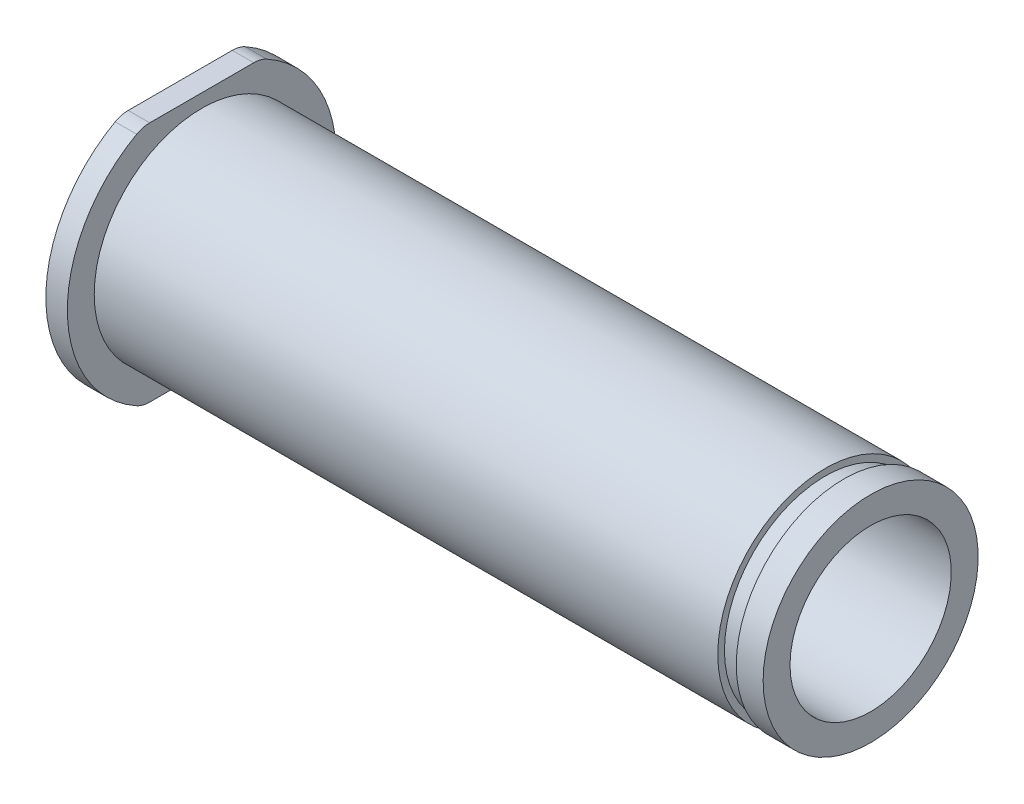
ISO-10303-21;
HEADER;
FILE_DESCRIPTION(('STEP AP214'),'2;1');
FILE_NAME('part.step','',(''),(''),'','','');
FILE_SCHEMA(('AUTOMOTIVE_DESIGN { 1 0 10303 214 1 1 1 1 }'));
ENDSEC;
DATA;
#1=APPLICATION_CONTEXT('core data for automotive mechanical design processes');
#2=APPLICATION_PROTOCOL_DEFINITION('international standard','automotive_design',2000,#1);
#3=PRODUCT_CONTEXT('',#1,'mechanical');
#4=PRODUCT('Part','Part','',(#3));
#5=PRODUCT_RELATED_PRODUCT_CATEGORY('part','',(#4));
#6=PRODUCT_DEFINITION_FORMATION('','',#4);
#7=PRODUCT_DEFINITION_CONTEXT('part definition',#1,'design');
#8=PRODUCT_DEFINITION('design','',#6,#7);
#9=PRODUCT_DEFINITION_SHAPE('','',#8);
#10=(LENGTH_UNIT() NAMED_UNIT(*) SI_UNIT(.MILLI.,.METRE.));
#11=(NAMED_UNIT(*) PLANE_ANGLE_UNIT() SI_UNIT($,.RADIAN.));
#12=(NAMED_UNIT(*) SI_UNIT($,.STERADIAN.) SOLID_ANGLE_UNIT());
#13=UNCERTAINTY_MEASURE_WITH_UNIT(LENGTH_MEASURE(1.E-05),#10,'distance_accuracy_value','');
#14=(GEOMETRIC_REPRESENTATION_CONTEXT(3) GLOBAL_UNCERTAINTY_ASSIGNED_CONTEXT((#13)) GLOBAL_UNIT_ASSIGNED_CONTEXT((#10,
#11,#12)) REPRESENTATION_CONTEXT('',''));
#15=CARTESIAN_POINT('',(0.,0.,0.));
#16=DIRECTION('',(0.,0.,1.));
#17=DIRECTION('',(1.,0.,0.));
#18=AXIS2_PLACEMENT_3D('',#15,#16,#17);
#19=CARTESIAN_POINT('',(0.,0.,0.));
#20=DIRECTION('',(-1.,0.,0.));
#21=DIRECTION('',(0.,0.,1.));
#22=AXIS2_PLACEMENT_3D('',#19,#20,#21);
#23=CYLINDRICAL_SURFACE('',#22,15.875);
#24=CARTESIAN_POINT('',(2.54,0.,0.));
#25=DIRECTION('',(-1.,0.,0.));
#26=DIRECTION('',(0.,0.,1.));
#27=AXIS2_PLACEMENT_3D('',#24,#25,#26);
#28=CIRCLE('',#27,15.875);
#29=CARTESIAN_POINT('',(2.54,13.890625,-7.68545132763035));
#30=VERTEX_POINT('',#29);
#31=CARTESIAN_POINT('',(2.54,-13.890625,-7.68545132763035));
#32=VERTEX_POINT('',#31);
#33=EDGE_CURVE('E140',#30,#32,#28,.T.);
#34=ORIENTED_EDGE('',*,*,#33,.T.);
#35=DIRECTION('',(-1.,0.,0.));
#36=VECTOR('',#35,1.);
#37=CARTESIAN_POINT('',(0.,-13.890625,-7.68545132763035));
#38=LINE('',#37,#36);
#39=CARTESIAN_POINT('',(0.,-13.890625,-7.68545132763035));
#40=VERTEX_POINT('',#39);
#41=EDGE_CURVE('E105',#32,#40,#38,.T.);
#42=ORIENTED_EDGE('',*,*,#41,.T.);
#43=CARTESIAN_POINT('',(0.,0.,0.));
#44=DIRECTION('',(-1.,0.,0.));
#45=DIRECTION('',(0.,0.,1.));
#46=AXIS2_PLACEMENT_3D('',#43,#44,#45);
#47=CIRCLE('',#46,15.875);
#48=CARTESIAN_POINT('',(0.,13.890625,-7.68545132763035));
#49=VERTEX_POINT('',#48);
#50=EDGE_CURVE('E139',#49,#40,#47,.T.);
#51=ORIENTED_EDGE('',*,*,#50,.F.);
#52=DIRECTION('',(-1.,0.,0.));
#53=VECTOR('',#52,1.);
#54=CARTESIAN_POINT('',(0.,13.890625,-7.68545132763035));
#55=LINE('',#54,#53);
#56=EDGE_CURVE('E110',#49,#30,#55,.F.);
#57=ORIENTED_EDGE('',*,*,#56,.T.);
#58=EDGE_LOOP('',(#34,#42,#51,#57));
#59=FACE_BOUND('',#58,.T.);
#60=ADVANCED_FACE('F33',(#59),#23,.T.);
#61=CARTESIAN_POINT('',(0.,15.875,0.));
#62=DIRECTION('',(1.,0.,0.));
#63=DIRECTION('',(0.,0.,-1.));
#64=AXIS2_PLACEMENT_3D('',#61,#62,#63);
#65=PLANE('',#64);
#66=CARTESIAN_POINT('',(0.,0.,0.));
#67=DIRECTION('',(-1.,0.,0.));
#68=DIRECTION('',(0.,0.,1.));
#69=AXIS2_PLACEMENT_3D('',#66,#67,#68);
#70=CIRCLE('',#69,9.525);
#71=CARTESIAN_POINT('',(0.,0.,9.525));
#72=VERTEX_POINT('',#71);
#73=EDGE_CURVE('E164',#72,#72,#70,.T.);
#74=ORIENTED_EDGE('',*,*,#73,.F.);
#75=EDGE_LOOP('',(#74));
#76=FACE_BOUND('',#75,.T.);
#77=ORIENTED_EDGE('',*,*,#50,.T.);
#78=CARTESIAN_POINT('',(0.,-11.1125,-6.14836106210428));
#79=DIRECTION('',(1.,0.,0.));
#80=DIRECTION('',(0.,0.,-1.));
#81=AXIS2_PLACEMENT_3D('',#78,#79,#80);
#82=CIRCLE('',#81,3.175);
#83=CARTESIAN_POINT('',(0.,-14.2875,-6.14836106210428));
#84=VERTEX_POINT('',#83);
#85=EDGE_CURVE('E178',#40,#84,#82,.F.);
#86=ORIENTED_EDGE('',*,*,#85,.T.);
#87=DIRECTION('',(0.,0.,-1.));
#88=VECTOR('',#87,1.);
#89=CARTESIAN_POINT('',(0.,-14.2875,-6.91975207287082));
#90=LINE('',#89,#88);
#91=CARTESIAN_POINT('',(0.,-14.2875,6.14836106210427));
#92=VERTEX_POINT('',#91);
#93=EDGE_CURVE('E121',#92,#84,#90,.T.);
#94=ORIENTED_EDGE('',*,*,#93,.F.);
#95=CARTESIAN_POINT('',(0.,-11.1125,6.14836106210427));
#96=DIRECTION('',(1.,0.,0.));
#97=DIRECTION('',(0.,0.,-1.));
#98=AXIS2_PLACEMENT_3D('',#95,#96,#97);
#99=CIRCLE('',#98,3.175);
#100=CARTESIAN_POINT('',(0.,-13.890625,7.68545132763034));
#101=VERTEX_POINT('',#100);
#102=EDGE_CURVE('E176',#92,#101,#99,.F.);
#103=ORIENTED_EDGE('',*,*,#102,.T.);
#104=CARTESIAN_POINT('',(0.,13.890625,7.68545132763034));
#105=VERTEX_POINT('',#104);
#106=EDGE_CURVE('E137',#101,#105,#47,.T.);
#107=ORIENTED_EDGE('',*,*,#106,.T.);
#108=CARTESIAN_POINT('',(0.,11.1125,6.14836106210427));
#109=DIRECTION('',(1.,0.,0.));
#110=DIRECTION('',(0.,0.,-1.));
#111=AXIS2_PLACEMENT_3D('',#108,#109,#110);
#112=CIRCLE('',#111,3.175);
#113=CARTESIAN_POINT('',(0.,14.2875,6.14836106210427));
#114=VERTEX_POINT('',#113);
#115=EDGE_CURVE('E48',#105,#114,#112,.F.);
#116=ORIENTED_EDGE('',*,*,#115,.T.);
#117=DIRECTION('',(0.,0.,1.));
#118=VECTOR('',#117,1.);
#119=CARTESIAN_POINT('',(0.,14.2875,-6.91975207287082));
#120=LINE('',#119,#118);
#121=CARTESIAN_POINT('',(0.,14.2875,-6.14836106210428));
#122=VERTEX_POINT('',#121);
#123=EDGE_CURVE('E130',#122,#114,#120,.T.);
#124=ORIENTED_EDGE('',*,*,#123,.F.);
#125=CARTESIAN_POINT('',(0.,11.1125,-6.14836106210428));
#126=DIRECTION('',(1.,0.,0.));
#127=DIRECTION('',(0.,0.,-1.));
#128=AXIS2_PLACEMENT_3D('',#125,#126,#127);
#129=CIRCLE('',#128,3.175);
#130=EDGE_CURVE('E56',#122,#49,#129,.F.);
#131=ORIENTED_EDGE('',*,*,#130,.T.);
#132=EDGE_LOOP('',(#77,#86,#94,#103,#107,#116,#124,#131));
#133=FACE_BOUND('',#132,.T.);
#134=ADVANCED_FACE('F193',(#76,#133),#65,.F.);
#135=CARTESIAN_POINT('',(0.,0.,0.));
#136=DIRECTION('',(-1.,0.,0.));
#137=DIRECTION('',(0.,0.,1.));
#138=AXIS2_PLACEMENT_3D('',#135,#136,#137);
#139=CYLINDRICAL_SURFACE('',#138,9.525);
#140=CARTESIAN_POINT('',(81.5594,0.,0.));
#141=DIRECTION('',(-1.,0.,0.));
#142=DIRECTION('',(0.,0.,1.));
#143=AXIS2_PLACEMENT_3D('',#140,#141,#142);
#144=CIRCLE('',#143,9.525);
#145=CARTESIAN_POINT('',(81.5594,0.,9.525));
#146=VERTEX_POINT('',#145);
#147=EDGE_CURVE('E161',#146,#146,#144,.T.);
#148=ORIENTED_EDGE('',*,*,#147,.F.);
#149=EDGE_LOOP('',(#148));
#150=FACE_BOUND('',#149,.T.);
#151=ORIENTED_EDGE('',*,*,#73,.T.);
#152=EDGE_LOOP('',(#151));
#153=FACE_BOUND('',#152,.T.);
#154=ADVANCED_FACE('F211',(#150,#153),#139,.F.);
#155=CARTESIAN_POINT('',(81.5594,9.525,0.));
#156=DIRECTION('',(-1.,0.,0.));
#157=DIRECTION('',(0.,0.,1.));
#158=AXIS2_PLACEMENT_3D('',#155,#156,#157);
#159=PLANE('',#158);
#160=CARTESIAN_POINT('',(81.5594,0.,0.));
#161=DIRECTION('',(-1.,0.,0.));
#162=DIRECTION('',(0.,0.,1.));
#163=AXIS2_PLACEMENT_3D('',#160,#161,#162);
#164=CIRCLE('',#163,12.7);
#165=CARTESIAN_POINT('',(81.5594,0.,12.7));
#166=VERTEX_POINT('',#165);
#167=EDGE_CURVE('E158',#166,#166,#164,.T.);
#168=ORIENTED_EDGE('',*,*,#167,.F.);
#169=EDGE_LOOP('',(#168));
#170=FACE_BOUND('',#169,.T.);
#171=ORIENTED_EDGE('',*,*,#147,.T.);
#172=EDGE_LOOP('',(#171));
#173=FACE_BOUND('',#172,.T.);
#174=ADVANCED_FACE('F243',(#170,#173),#159,.F.);
#175=CARTESIAN_POINT('',(0.,0.,0.));
#176=DIRECTION('',(-1.,0.,0.));
#177=DIRECTION('',(0.,0.,1.));
#178=AXIS2_PLACEMENT_3D('',#175,#176,#177);
#179=CYLINDRICAL_SURFACE('',#178,12.7);
#180=CARTESIAN_POINT('',(78.3844,0.,0.));
#181=DIRECTION('',(-1.,0.,0.));
#182=DIRECTION('',(0.,0.,1.));
#183=AXIS2_PLACEMENT_3D('',#180,#181,#182);
#184=CIRCLE('',#183,12.7);
#185=CARTESIAN_POINT('',(78.3844,0.,12.7));
#186=VERTEX_POINT('',#185);
#187=EDGE_CURVE('E155',#186,#186,#184,.T.);
#188=ORIENTED_EDGE('',*,*,#187,.F.);
#189=EDGE_LOOP('',(#188));
#190=FACE_BOUND('',#189,.T.);
#191=ORIENTED_EDGE('',*,*,#167,.T.);
#192=EDGE_LOOP('',(#191));
#193=FACE_BOUND('',#192,.T.);
#194=ADVANCED_FACE('F239',(#190,#193),#179,.T.);
#195=CARTESIAN_POINT('',(78.3844,12.7,0.));
#196=DIRECTION('',(1.,0.,0.));
#197=DIRECTION('',(0.,0.,-1.));
#198=AXIS2_PLACEMENT_3D('',#195,#196,#197);
#199=PLANE('',#198);
#200=CARTESIAN_POINT('',(78.3844,0.,0.));
#201=DIRECTION('',(-1.,0.,0.));
#202=DIRECTION('',(0.,0.,1.));
#203=AXIS2_PLACEMENT_3D('',#200,#201,#202);
#204=CIRCLE('',#203,11.9126);
#205=CARTESIAN_POINT('',(78.3844,0.,11.9126));
#206=VERTEX_POINT('',#205);
#207=EDGE_CURVE('E152',#206,#206,#204,.T.);
#208=ORIENTED_EDGE('',*,*,#207,.F.);
#209=EDGE_LOOP('',(#208));
#210=FACE_BOUND('',#209,.T.);
#211=ORIENTED_EDGE('',*,*,#187,.T.);
#212=EDGE_LOOP('',(#211));
#213=FACE_BOUND('',#212,.T.);
#214=ADVANCED_FACE('F235',(#210,#213),#199,.F.);
#215=CARTESIAN_POINT('',(0.,0.,0.));
#216=DIRECTION('',(-1.,0.,0.));
#217=DIRECTION('',(0.,0.,1.));
#218=AXIS2_PLACEMENT_3D('',#215,#216,#217);
#219=CYLINDRICAL_SURFACE('',#218,11.9126);
#220=CARTESIAN_POINT('',(76.2,0.,0.));
#221=DIRECTION('',(-1.,0.,0.));
#222=DIRECTION('',(0.,0.,1.));
#223=AXIS2_PLACEMENT_3D('',#220,#221,#222);
#224=CIRCLE('',#223,11.9126);
#225=CARTESIAN_POINT('',(76.2,0.,11.9126));
#226=VERTEX_POINT('',#225);
#227=EDGE_CURVE('E149',#226,#226,#224,.T.);
#228=ORIENTED_EDGE('',*,*,#227,.F.);
#229=EDGE_LOOP('',(#228));
#230=FACE_BOUND('',#229,.T.);
#231=ORIENTED_EDGE('',*,*,#207,.T.);
#232=EDGE_LOOP('',(#231));
#233=FACE_BOUND('',#232,.T.);
#234=ADVANCED_FACE('F231',(#230,#233),#219,.T.);
#235=CARTESIAN_POINT('',(76.2,11.9126,0.));
#236=DIRECTION('',(-1.,0.,0.));
#237=DIRECTION('',(0.,0.,1.));
#238=AXIS2_PLACEMENT_3D('',#235,#236,#237);
#239=PLANE('',#238);
#240=CARTESIAN_POINT('',(76.2,0.,0.));
#241=DIRECTION('',(-1.,0.,0.));
#242=DIRECTION('',(0.,0.,1.));
#243=AXIS2_PLACEMENT_3D('',#240,#241,#242);
#244=CIRCLE('',#243,12.7);
#245=CARTESIAN_POINT('',(76.2,0.,12.7));
#246=VERTEX_POINT('',#245);
#247=EDGE_CURVE('E146',#246,#246,#244,.T.);
#248=ORIENTED_EDGE('',*,*,#247,.F.);
#249=EDGE_LOOP('',(#248));
#250=FACE_BOUND('',#249,.T.);
#251=ORIENTED_EDGE('',*,*,#227,.T.);
#252=EDGE_LOOP('',(#251));
#253=FACE_BOUND('',#252,.T.);
#254=ADVANCED_FACE('F225',(#250,#253),#239,.F.);
#255=CARTESIAN_POINT('',(0.,0.,0.));
#256=DIRECTION('',(-1.,0.,0.));
#257=DIRECTION('',(0.,0.,1.));
#258=AXIS2_PLACEMENT_3D('',#255,#256,#257);
#259=CYLINDRICAL_SURFACE('',#258,12.7);
#260=CARTESIAN_POINT('',(2.54,0.,0.));
#261=DIRECTION('',(-1.,0.,0.));
#262=DIRECTION('',(0.,0.,1.));
#263=AXIS2_PLACEMENT_3D('',#260,#261,#262);
#264=CIRCLE('',#263,12.7);
#265=CARTESIAN_POINT('',(2.54,0.,12.7));
#266=VERTEX_POINT('',#265);
#267=EDGE_CURVE('E142',#266,#266,#264,.T.);
#268=ORIENTED_EDGE('',*,*,#267,.F.);
#269=EDGE_LOOP('',(#268));
#270=FACE_BOUND('',#269,.T.);
#271=ORIENTED_EDGE('',*,*,#247,.T.);
#272=EDGE_LOOP('',(#271));
#273=FACE_BOUND('',#272,.T.);
#274=ADVANCED_FACE('F221',(#270,#273),#259,.T.);
#275=CARTESIAN_POINT('',(2.54,12.7,0.));
#276=DIRECTION('',(-1.,0.,0.));
#277=DIRECTION('',(0.,0.,1.));
#278=AXIS2_PLACEMENT_3D('',#275,#276,#277);
#279=PLANE('',#278);
#280=DIRECTION('',(0.,0.,1.));
#281=VECTOR('',#280,1.);
#282=CARTESIAN_POINT('',(2.54,-14.2875,-6.91975207287082));
#283=LINE('',#282,#281);
#284=CARTESIAN_POINT('',(2.54,-14.2875,-6.14836106210428));
#285=VERTEX_POINT('',#284);
#286=CARTESIAN_POINT('',(2.54,-14.2875,6.14836106210427));
#287=VERTEX_POINT('',#286);
#288=EDGE_CURVE('E118',#285,#287,#283,.T.);
#289=ORIENTED_EDGE('',*,*,#288,.F.);
#290=CARTESIAN_POINT('',(2.54,-11.1125,-6.14836106210428));
#291=DIRECTION('',(-1.,0.,0.));
#292=DIRECTION('',(0.,0.,1.));
#293=AXIS2_PLACEMENT_3D('',#290,#291,#292);
#294=CIRCLE('',#293,3.175);
#295=EDGE_CURVE('E100',#285,#32,#294,.F.);
#296=ORIENTED_EDGE('',*,*,#295,.T.);
#297=ORIENTED_EDGE('',*,*,#33,.F.);
#298=CARTESIAN_POINT('',(2.54,11.1125,-6.14836106210428));
#299=DIRECTION('',(-1.,0.,0.));
#300=DIRECTION('',(0.,0.,1.));
#301=AXIS2_PLACEMENT_3D('',#298,#299,#300);
#302=CIRCLE('',#301,3.175);
#303=CARTESIAN_POINT('',(2.54,14.2875,-6.14836106210428));
#304=VERTEX_POINT('',#303);
#305=EDGE_CURVE('E169',#30,#304,#302,.F.);
#306=ORIENTED_EDGE('',*,*,#305,.T.);
#307=DIRECTION('',(0.,0.,-1.));
#308=VECTOR('',#307,1.);
#309=CARTESIAN_POINT('',(2.54,14.2875,-6.91975207287082));
#310=LINE('',#309,#308);
#311=CARTESIAN_POINT('',(2.54,14.2875,6.14836106210427));
#312=VERTEX_POINT('',#311);
#313=EDGE_CURVE('E134',#312,#304,#310,.T.);
#314=ORIENTED_EDGE('',*,*,#313,.F.);
#315=CARTESIAN_POINT('',(2.54,11.1125,6.14836106210427));
#316=DIRECTION('',(-1.,0.,0.));
#317=DIRECTION('',(0.,0.,1.));
#318=AXIS2_PLACEMENT_3D('',#315,#316,#317);
#319=CIRCLE('',#318,3.175);
#320=CARTESIAN_POINT('',(2.54,13.890625,7.68545132763034));
#321=VERTEX_POINT('',#320);
#322=EDGE_CURVE('E122',#312,#321,#319,.F.);
#323=ORIENTED_EDGE('',*,*,#322,.T.);
#324=CARTESIAN_POINT('',(2.54,-13.890625,7.68545132763034));
#325=VERTEX_POINT('',#324);
#326=EDGE_CURVE('E143',#325,#321,#28,.T.);
#327=ORIENTED_EDGE('',*,*,#326,.F.);
#328=CARTESIAN_POINT('',(2.54,-11.1125,6.14836106210427));
#329=DIRECTION('',(-1.,0.,0.));
#330=DIRECTION('',(0.,0.,1.));
#331=AXIS2_PLACEMENT_3D('',#328,#329,#330);
#332=CIRCLE('',#331,3.175);
#333=EDGE_CURVE('E111',#325,#287,#332,.F.);
#334=ORIENTED_EDGE('',*,*,#333,.T.);
#335=EDGE_LOOP('',(#289,#296,#297,#306,#314,#323,#327,#334));
#336=FACE_BOUND('',#335,.T.);
#337=ORIENTED_EDGE('',*,*,#267,.T.);
#338=EDGE_LOOP('',(#337));
#339=FACE_BOUND('',#338,.T.);
#340=ADVANCED_FACE('F125',(#336,#339),#279,.F.);
#341=ORIENTED_EDGE('',*,*,#106,.F.);
#342=DIRECTION('',(-1.,0.,0.));
#343=VECTOR('',#342,1.);
#344=CARTESIAN_POINT('',(0.,-13.890625,7.68545132763034));
#345=LINE('',#344,#343);
#346=EDGE_CURVE('E182',#101,#325,#345,.F.);
#347=ORIENTED_EDGE('',*,*,#346,.T.);
#348=ORIENTED_EDGE('',*,*,#326,.T.);
#349=DIRECTION('',(-1.,0.,0.));
#350=VECTOR('',#349,1.);
#351=CARTESIAN_POINT('',(0.,13.890625,7.68545132763034));
#352=LINE('',#351,#350);
#353=EDGE_CURVE('E180',#321,#105,#352,.T.);
#354=ORIENTED_EDGE('',*,*,#353,.T.);
#355=EDGE_LOOP('',(#341,#347,#348,#354));
#356=FACE_BOUND('',#355,.T.);
#357=ADVANCED_FACE('F199',(#356),#23,.T.);
#358=CARTESIAN_POINT('',(81.5604,14.2875,-6.91975207287082));
#359=DIRECTION('',(0.,-1.,0.));
#360=DIRECTION('',(0.,0.,-1.));
#361=AXIS2_PLACEMENT_3D('',#358,#359,#360);
#362=PLANE('',#361);
#363=ORIENTED_EDGE('',*,*,#313,.T.);
#364=DIRECTION('',(-1.,0.,0.));
#365=VECTOR('',#364,1.);
#366=CARTESIAN_POINT('',(81.5604,14.2875,-6.14836106210428));
#367=LINE('',#366,#365);
#368=EDGE_CURVE('E11',#304,#122,#367,.T.);
#369=ORIENTED_EDGE('',*,*,#368,.T.);
#370=ORIENTED_EDGE('',*,*,#123,.T.);
#371=DIRECTION('',(-1.,0.,0.));
#372=VECTOR('',#371,1.);
#373=CARTESIAN_POINT('',(81.5604,14.2875,6.14836106210427));
#374=LINE('',#373,#372);
#375=EDGE_CURVE('E41',#114,#312,#374,.F.);
#376=ORIENTED_EDGE('',*,*,#375,.T.);
#377=EDGE_LOOP('',(#363,#369,#370,#376));
#378=FACE_BOUND('',#377,.T.);
#379=ADVANCED_FACE('F187',(#378),#362,.F.);
#380=CARTESIAN_POINT('',(81.5604,-14.2875,-6.91975207287082));
#381=DIRECTION('',(0.,1.,0.));
#382=DIRECTION('',(0.,0.,1.));
#383=AXIS2_PLACEMENT_3D('',#380,#381,#382);
#384=PLANE('',#383);
#385=ORIENTED_EDGE('',*,*,#93,.T.);
#386=DIRECTION('',(-1.,0.,0.));
#387=VECTOR('',#386,1.);
#388=CARTESIAN_POINT('',(81.5604,-14.2875,-6.14836106210428));
#389=LINE('',#388,#387);
#390=EDGE_CURVE('E104',#84,#285,#389,.F.);
#391=ORIENTED_EDGE('',*,*,#390,.T.);
#392=ORIENTED_EDGE('',*,*,#288,.T.);
#393=DIRECTION('',(-1.,0.,0.));
#394=VECTOR('',#393,1.);
#395=CARTESIAN_POINT('',(81.5604,-14.2875,6.14836106210427));
#396=LINE('',#395,#394);
#397=EDGE_CURVE('E123',#287,#92,#396,.T.);
#398=ORIENTED_EDGE('',*,*,#397,.T.);
#399=EDGE_LOOP('',(#385,#391,#392,#398));
#400=FACE_BOUND('',#399,.T.);
#401=ADVANCED_FACE('F116',(#400),#384,.F.);
#402=CARTESIAN_POINT('',(0.,-11.1125,-6.14836106210428));
#403=DIRECTION('',(-1.,0.,0.));
#404=DIRECTION('',(0.,0.,1.));
#405=AXIS2_PLACEMENT_3D('',#402,#403,#404);
#406=CYLINDRICAL_SURFACE('',#405,3.175);
#407=ORIENTED_EDGE('',*,*,#85,.F.);
#408=ORIENTED_EDGE('',*,*,#41,.F.);
#409=ORIENTED_EDGE('',*,*,#295,.F.);
#410=ORIENTED_EDGE('',*,*,#390,.F.);
#411=EDGE_LOOP('',(#407,#408,#409,#410));
#412=FACE_BOUND('',#411,.T.);
#413=ADVANCED_FACE('F103',(#412),#406,.T.);
#414=CARTESIAN_POINT('',(0.,-11.1125,6.14836106210427));
#415=DIRECTION('',(-1.,0.,0.));
#416=DIRECTION('',(0.,0.,1.));
#417=AXIS2_PLACEMENT_3D('',#414,#415,#416);
#418=CYLINDRICAL_SURFACE('',#417,3.175);
#419=ORIENTED_EDGE('',*,*,#333,.F.);
#420=ORIENTED_EDGE('',*,*,#346,.F.);
#421=ORIENTED_EDGE('',*,*,#102,.F.);
#422=ORIENTED_EDGE('',*,*,#397,.F.);
#423=EDGE_LOOP('',(#419,#420,#421,#422));
#424=FACE_BOUND('',#423,.T.);
#425=ADVANCED_FACE('F205',(#424),#418,.T.);
#426=CARTESIAN_POINT('',(0.,11.1125,-6.14836106210428));
#427=DIRECTION('',(-1.,0.,0.));
#428=DIRECTION('',(0.,0.,1.));
#429=AXIS2_PLACEMENT_3D('',#426,#427,#428);
#430=CYLINDRICAL_SURFACE('',#429,3.175);
#431=ORIENTED_EDGE('',*,*,#305,.F.);
#432=ORIENTED_EDGE('',*,*,#56,.F.);
#433=ORIENTED_EDGE('',*,*,#130,.F.);
#434=ORIENTED_EDGE('',*,*,#368,.F.);
#435=EDGE_LOOP('',(#431,#432,#433,#434));
#436=FACE_BOUND('',#435,.T.);
#437=ADVANCED_FACE('F191',(#436),#430,.T.);
#438=CARTESIAN_POINT('',(0.,11.1125,6.14836106210427));
#439=DIRECTION('',(-1.,0.,0.));
#440=DIRECTION('',(0.,0.,1.));
#441=AXIS2_PLACEMENT_3D('',#438,#439,#440);
#442=CYLINDRICAL_SURFACE('',#441,3.175);
#443=ORIENTED_EDGE('',*,*,#115,.F.);
#444=ORIENTED_EDGE('',*,*,#353,.F.);
#445=ORIENTED_EDGE('',*,*,#322,.F.);
#446=ORIENTED_EDGE('',*,*,#375,.F.);
#447=EDGE_LOOP('',(#443,#444,#445,#446));
#448=FACE_BOUND('',#447,.T.);
#449=ADVANCED_FACE('F35',(#448),#442,.T.);
#450=CLOSED_SHELL('',(#60,#134,#154,#174,#194,#214,#234,#254,#274,#340,#357,#379,#401,#413,#425,
#437,#449));
#451=MANIFOLD_SOLID_BREP('B2',#450);
#452=ADVANCED_BREP_SHAPE_REPRESENTATION('',(#18,#451),#14);
#453=SHAPE_DEFINITION_REPRESENTATION(#9,#452);
ENDSEC;
END-ISO-10303-21;
